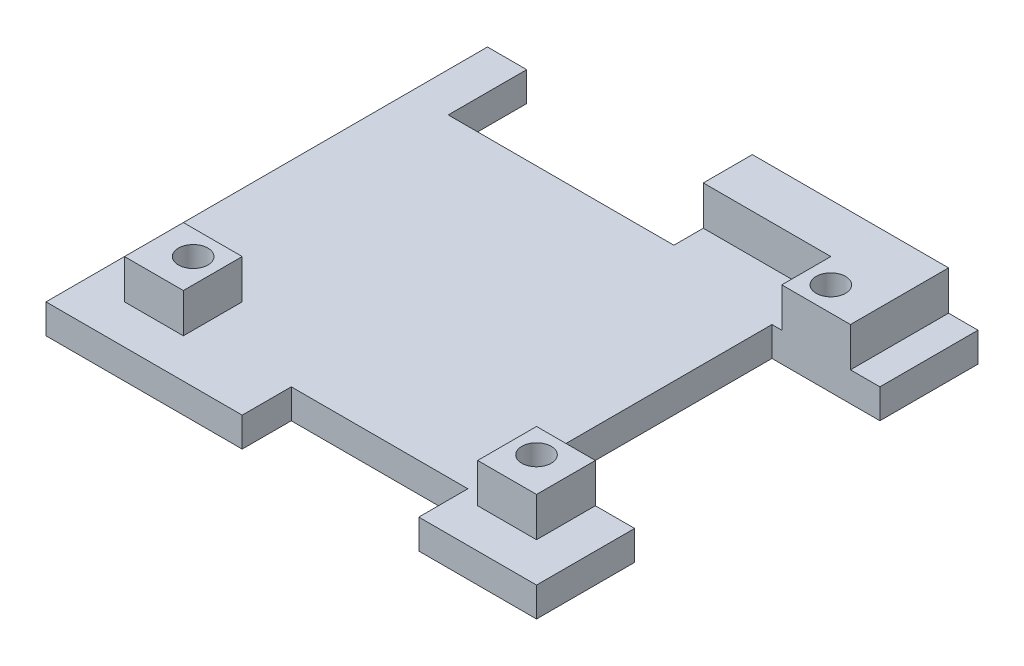
ISO-10303-21;
HEADER;
FILE_DESCRIPTION(('STEP AP214'),'2;1');
FILE_NAME('part.step','',(''),(''),'','','');
FILE_SCHEMA(('AUTOMOTIVE_DESIGN { 1 0 10303 214 1 1 1 1 }'));
ENDSEC;
DATA;
#1=APPLICATION_CONTEXT('core data for automotive mechanical design processes');
#2=APPLICATION_PROTOCOL_DEFINITION('international standard','automotive_design',2000,#1);
#3=PRODUCT_CONTEXT('',#1,'mechanical');
#4=PRODUCT('Part','Part','',(#3));
#5=PRODUCT_RELATED_PRODUCT_CATEGORY('part','',(#4));
#6=PRODUCT_DEFINITION_FORMATION('','',#4);
#7=PRODUCT_DEFINITION_CONTEXT('part definition',#1,'design');
#8=PRODUCT_DEFINITION('design','',#6,#7);
#9=PRODUCT_DEFINITION_SHAPE('','',#8);
#10=(LENGTH_UNIT() NAMED_UNIT(*) SI_UNIT(.MILLI.,.METRE.));
#11=(NAMED_UNIT(*) PLANE_ANGLE_UNIT() SI_UNIT($,.RADIAN.));
#12=(NAMED_UNIT(*) SI_UNIT($,.STERADIAN.) SOLID_ANGLE_UNIT());
#13=UNCERTAINTY_MEASURE_WITH_UNIT(LENGTH_MEASURE(1.E-05),#10,'distance_accuracy_value','');
#14=(GEOMETRIC_REPRESENTATION_CONTEXT(3) GLOBAL_UNCERTAINTY_ASSIGNED_CONTEXT((#13)) GLOBAL_UNIT_ASSIGNED_CONTEXT((#10,
#11,#12)) REPRESENTATION_CONTEXT('',''));
#15=CARTESIAN_POINT('',(0.,0.,0.));
#16=DIRECTION('',(0.,0.,1.));
#17=DIRECTION('',(1.,0.,0.));
#18=AXIS2_PLACEMENT_3D('',#15,#16,#17);
#19=CARTESIAN_POINT('',(0.,3.,0.));
#20=DIRECTION('',(0.,1.,0.));
#21=DIRECTION('',(0.,0.,1.));
#22=AXIS2_PLACEMENT_3D('',#19,#20,#21);
#23=PLANE('',#22);
#24=DIRECTION('',(1.,0.,0.));
#25=VECTOR('',#24,1.);
#26=CARTESIAN_POINT('',(14.,3.,12.5));
#27=LINE('',#26,#25);
#28=CARTESIAN_POINT('',(21.,3.,12.5));
#29=VERTEX_POINT('',#28);
#30=CARTESIAN_POINT('',(25.,3.,12.5));
#31=VERTEX_POINT('',#30);
#32=EDGE_CURVE('E824',#29,#31,#27,.T.);
#33=ORIENTED_EDGE('',*,*,#32,.F.);
#34=DIRECTION('',(0.,0.,-1.));
#35=VECTOR('',#34,1.);
#36=CARTESIAN_POINT('',(21.,3.,12.5));
#37=LINE('',#36,#35);
#38=CARTESIAN_POINT('',(21.,3.,18.5));
#39=VERTEX_POINT('',#38);
#40=EDGE_CURVE('E363',#39,#29,#37,.T.);
#41=ORIENTED_EDGE('',*,*,#40,.F.);
#42=DIRECTION('',(1.,0.,0.));
#43=VECTOR('',#42,1.);
#44=CARTESIAN_POINT('',(15.,3.,18.5));
#45=LINE('',#44,#43);
#46=CARTESIAN_POINT('',(15.,3.,18.5));
#47=VERTEX_POINT('',#46);
#48=EDGE_CURVE('E372',#47,#39,#45,.T.);
#49=ORIENTED_EDGE('',*,*,#48,.F.);
#50=DIRECTION('',(0.,0.,1.));
#51=VECTOR('',#50,1.);
#52=CARTESIAN_POINT('',(15.,3.,12.5));
#53=LINE('',#52,#51);
#54=CARTESIAN_POINT('',(15.,3.,12.5));
#55=VERTEX_POINT('',#54);
#56=EDGE_CURVE('E355',#55,#47,#53,.T.);
#57=ORIENTED_EDGE('',*,*,#56,.F.);
#58=CARTESIAN_POINT('',(14.,3.,12.5));
#59=VERTEX_POINT('',#58);
#60=EDGE_CURVE('E239',#59,#55,#27,.T.);
#61=ORIENTED_EDGE('',*,*,#60,.F.);
#62=DIRECTION('',(0.,0.,1.));
#63=VECTOR('',#62,1.);
#64=CARTESIAN_POINT('',(14.,3.,-12.5));
#65=LINE('',#64,#63);
#66=CARTESIAN_POINT('',(14.,3.,-12.5));
#67=VERTEX_POINT('',#66);
#68=EDGE_CURVE('E248',#67,#59,#65,.T.);
#69=ORIENTED_EDGE('',*,*,#68,.F.);
#70=DIRECTION('',(-1.,0.,0.));
#71=VECTOR('',#70,1.);
#72=CARTESIAN_POINT('',(25.,3.,-12.5));
#73=LINE('',#72,#71);
#74=CARTESIAN_POINT('',(15.,3.,-12.5));
#75=VERTEX_POINT('',#74);
#76=EDGE_CURVE('E249',#75,#67,#73,.T.);
#77=ORIENTED_EDGE('',*,*,#76,.F.);
#78=DIRECTION('',(0.,0.,1.));
#79=VECTOR('',#78,1.);
#80=CARTESIAN_POINT('',(15.,3.,-17.5));
#81=LINE('',#80,#79);
#82=CARTESIAN_POINT('',(15.,3.,-17.5));
#83=VERTEX_POINT('',#82);
#84=EDGE_CURVE('E417',#83,#75,#81,.T.);
#85=ORIENTED_EDGE('',*,*,#84,.F.);
#86=DIRECTION('',(1.,0.,0.));
#87=VECTOR('',#86,1.);
#88=CARTESIAN_POINT('',(2.,3.,-17.5));
#89=LINE('',#88,#87);
#90=CARTESIAN_POINT('',(2.,3.,-17.5));
#91=VERTEX_POINT('',#90);
#92=EDGE_CURVE('E429',#91,#83,#89,.T.);
#93=ORIENTED_EDGE('',*,*,#92,.F.);
#94=DIRECTION('',(0.,0.,-1.));
#95=VECTOR('',#94,1.);
#96=CARTESIAN_POINT('',(1.99999999999999,3.,-22.5));
#97=LINE('',#96,#95);
#98=CARTESIAN_POINT('',(1.99999999999999,3.,-14.5));
#99=VERTEX_POINT('',#98);
#100=EDGE_CURVE('E350',#99,#91,#97,.T.);
#101=ORIENTED_EDGE('',*,*,#100,.F.);
#102=DIRECTION('',(1.,0.,0.));
#103=VECTOR('',#102,1.);
#104=CARTESIAN_POINT('',(-21.,3.,-14.5));
#105=LINE('',#104,#103);
#106=CARTESIAN_POINT('',(-21.,3.,-14.5));
#107=VERTEX_POINT('',#106);
#108=EDGE_CURVE('E347',#107,#99,#105,.T.);
#109=ORIENTED_EDGE('',*,*,#108,.F.);
#110=DIRECTION('',(0.,0.,1.));
#111=VECTOR('',#110,1.);
#112=CARTESIAN_POINT('',(-21.,3.,-22.5));
#113=LINE('',#112,#111);
#114=CARTESIAN_POINT('',(-21.,3.,-22.5));
#115=VERTEX_POINT('',#114);
#116=EDGE_CURVE('E344',#115,#107,#113,.T.);
#117=ORIENTED_EDGE('',*,*,#116,.F.);
#118=DIRECTION('',(-1.,0.,0.));
#119=VECTOR('',#118,1.);
#120=CARTESIAN_POINT('',(-25.,3.,-22.5));
#121=LINE('',#120,#119);
#122=CARTESIAN_POINT('',(-25.,3.,-22.5));
#123=VERTEX_POINT('',#122);
#124=EDGE_CURVE('E258',#115,#123,#121,.T.);
#125=ORIENTED_EDGE('',*,*,#124,.T.);
#126=DIRECTION('',(0.,0.,1.));
#127=VECTOR('',#126,1.);
#128=CARTESIAN_POINT('',(-25.,3.,-22.5));
#129=LINE('',#128,#127);
#130=CARTESIAN_POINT('',(-25.,3.,22.5));
#131=VERTEX_POINT('',#130);
#132=EDGE_CURVE('E268',#123,#131,#129,.T.);
#133=ORIENTED_EDGE('',*,*,#132,.T.);
#134=DIRECTION('',(1.,0.,0.));
#135=VECTOR('',#134,1.);
#136=CARTESIAN_POINT('',(-25.,3.,22.5));
#137=LINE('',#136,#135);
#138=CARTESIAN_POINT('',(-5.,3.,22.5));
#139=VERTEX_POINT('',#138);
#140=EDGE_CURVE('E271',#131,#139,#137,.T.);
#141=ORIENTED_EDGE('',*,*,#140,.T.);
#142=DIRECTION('',(0.,0.,1.));
#143=VECTOR('',#142,1.);
#144=CARTESIAN_POINT('',(-5.,3.,22.5));
#145=LINE('',#144,#143);
#146=CARTESIAN_POINT('',(-5.,3.,17.5));
#147=VERTEX_POINT('',#146);
#148=EDGE_CURVE('E334',#147,#139,#145,.T.);
#149=ORIENTED_EDGE('',*,*,#148,.F.);
#150=DIRECTION('',(-1.,0.,0.));
#151=VECTOR('',#150,1.);
#152=CARTESIAN_POINT('',(-5.,3.,17.5));
#153=LINE('',#152,#151);
#154=CARTESIAN_POINT('',(13.,3.,17.5));
#155=VERTEX_POINT('',#154);
#156=EDGE_CURVE('E330',#155,#147,#153,.T.);
#157=ORIENTED_EDGE('',*,*,#156,.F.);
#158=DIRECTION('',(0.,0.,-1.));
#159=VECTOR('',#158,1.);
#160=CARTESIAN_POINT('',(13.,3.,17.5));
#161=LINE('',#160,#159);
#162=CARTESIAN_POINT('',(13.,3.,22.5));
#163=VERTEX_POINT('',#162);
#164=EDGE_CURVE('E328',#163,#155,#161,.T.);
#165=ORIENTED_EDGE('',*,*,#164,.F.);
#166=CARTESIAN_POINT('',(25.,3.,22.5));
#167=VERTEX_POINT('',#166);
#168=EDGE_CURVE('E270',#163,#167,#137,.T.);
#169=ORIENTED_EDGE('',*,*,#168,.T.);
#170=DIRECTION('',(0.,0.,-1.));
#171=VECTOR('',#170,1.);
#172=CARTESIAN_POINT('',(25.,3.,-22.5));
#173=LINE('',#172,#171);
#174=EDGE_CURVE('E254',#167,#31,#173,.T.);
#175=ORIENTED_EDGE('',*,*,#174,.T.);
#176=EDGE_LOOP('',(#33,#41,#49,#57,#61,#69,#77,#85,#93,#101,#109,#117,#125,#133,#141,#149,#157,
#165,#169,#175));
#177=FACE_BOUND('',#176,.T.);
#178=DIRECTION('',(1.,0.,0.));
#179=VECTOR('',#178,1.);
#180=CARTESIAN_POINT('',(-21.,3.,18.5));
#181=LINE('',#180,#179);
#182=CARTESIAN_POINT('',(-21.,3.,18.5));
#183=VERTEX_POINT('',#182);
#184=CARTESIAN_POINT('',(-15.,3.,18.5));
#185=VERTEX_POINT('',#184);
#186=EDGE_CURVE('E400',#183,#185,#181,.T.);
#187=ORIENTED_EDGE('',*,*,#186,.F.);
#188=DIRECTION('',(0.,0.,1.));
#189=VECTOR('',#188,1.);
#190=CARTESIAN_POINT('',(-21.,3.,12.5));
#191=LINE('',#190,#189);
#192=CARTESIAN_POINT('',(-21.,3.,12.5));
#193=VERTEX_POINT('',#192);
#194=EDGE_CURVE('E386',#193,#183,#191,.T.);
#195=ORIENTED_EDGE('',*,*,#194,.F.);
#196=DIRECTION('',(-1.,0.,0.));
#197=VECTOR('',#196,1.);
#198=CARTESIAN_POINT('',(-21.,3.,12.5));
#199=LINE('',#198,#197);
#200=CARTESIAN_POINT('',(-15.,3.,12.5));
#201=VERTEX_POINT('',#200);
#202=EDGE_CURVE('E391',#201,#193,#199,.T.);
#203=ORIENTED_EDGE('',*,*,#202,.F.);
#204=DIRECTION('',(0.,0.,-1.));
#205=VECTOR('',#204,1.);
#206=CARTESIAN_POINT('',(-15.,3.,12.5));
#207=LINE('',#206,#205);
#208=EDGE_CURVE('E402',#185,#201,#207,.T.);
#209=ORIENTED_EDGE('',*,*,#208,.F.);
#210=EDGE_LOOP('',(#187,#195,#203,#209));
#211=FACE_BOUND('',#210,.T.);
#212=ADVANCED_FACE('F34',(#177,#211),#23,.T.);
#213=CARTESIAN_POINT('',(25.,3.,-22.5));
#214=DIRECTION('',(-1.,0.,0.));
#215=DIRECTION('',(0.,0.,1.));
#216=AXIS2_PLACEMENT_3D('',#213,#214,#215);
#217=PLANE('',#216);
#218=DIRECTION('',(0.,0.,-1.));
#219=VECTOR('',#218,1.);
#220=CARTESIAN_POINT('',(25.,0.,-22.5));
#221=LINE('',#220,#219);
#222=CARTESIAN_POINT('',(25.,0.,22.5));
#223=VERTEX_POINT('',#222);
#224=CARTESIAN_POINT('',(25.,0.,12.5));
#225=VERTEX_POINT('',#224);
#226=EDGE_CURVE('E275',#223,#225,#221,.T.);
#227=ORIENTED_EDGE('',*,*,#226,.T.);
#228=DIRECTION('',(0.,1.,0.));
#229=VECTOR('',#228,1.);
#230=CARTESIAN_POINT('',(25.,-1.,12.5));
#231=LINE('',#230,#229);
#232=EDGE_CURVE('E324',#225,#31,#231,.T.);
#233=ORIENTED_EDGE('',*,*,#232,.T.);
#234=ORIENTED_EDGE('',*,*,#174,.F.);
#235=DIRECTION('',(0.,-1.,0.));
#236=VECTOR('',#235,1.);
#237=CARTESIAN_POINT('',(25.,3.,22.5));
#238=LINE('',#237,#236);
#239=EDGE_CURVE('E274',#167,#223,#238,.T.);
#240=ORIENTED_EDGE('',*,*,#239,.T.);
#241=EDGE_LOOP('',(#227,#233,#234,#240));
#242=FACE_BOUND('',#241,.T.);
#243=ADVANCED_FACE('F461',(#242),#217,.F.);
#244=CARTESIAN_POINT('',(-25.,3.,22.5));
#245=DIRECTION('',(0.,0.,-1.));
#246=DIRECTION('',(-1.,0.,0.));
#247=AXIS2_PLACEMENT_3D('',#244,#245,#246);
#248=PLANE('',#247);
#249=DIRECTION('',(1.,0.,0.));
#250=VECTOR('',#249,1.);
#251=CARTESIAN_POINT('',(-25.,0.,22.5));
#252=LINE('',#251,#250);
#253=CARTESIAN_POINT('',(-25.,0.,22.5));
#254=VERTEX_POINT('',#253);
#255=CARTESIAN_POINT('',(-5.,0.,22.5));
#256=VERTEX_POINT('',#255);
#257=EDGE_CURVE('E255',#254,#256,#252,.T.);
#258=ORIENTED_EDGE('',*,*,#257,.T.);
#259=DIRECTION('',(0.,1.,0.));
#260=VECTOR('',#259,1.);
#261=CARTESIAN_POINT('',(-5.,-1.,22.5));
#262=LINE('',#261,#260);
#263=EDGE_CURVE('E337',#256,#139,#262,.T.);
#264=ORIENTED_EDGE('',*,*,#263,.T.);
#265=ORIENTED_EDGE('',*,*,#140,.F.);
#266=DIRECTION('',(0.,-1.,0.));
#267=VECTOR('',#266,1.);
#268=CARTESIAN_POINT('',(-25.,3.,22.5));
#269=LINE('',#268,#267);
#270=EDGE_CURVE('E287',#131,#254,#269,.T.);
#271=ORIENTED_EDGE('',*,*,#270,.T.);
#272=EDGE_LOOP('',(#258,#264,#265,#271));
#273=FACE_BOUND('',#272,.T.);
#274=ADVANCED_FACE('F463',(#273),#248,.F.);
#275=CARTESIAN_POINT('',(-25.,3.,-22.5));
#276=DIRECTION('',(0.,0.,1.));
#277=DIRECTION('',(1.,0.,0.));
#278=AXIS2_PLACEMENT_3D('',#275,#276,#277);
#279=PLANE('',#278);
#280=ORIENTED_EDGE('',*,*,#124,.F.);
#281=DIRECTION('',(0.,1.,0.));
#282=VECTOR('',#281,1.);
#283=CARTESIAN_POINT('',(-21.,-1.,-22.5));
#284=LINE('',#283,#282);
#285=CARTESIAN_POINT('',(-21.,0.,-22.5));
#286=VERTEX_POINT('',#285);
#287=EDGE_CURVE('E353',#286,#115,#284,.T.);
#288=ORIENTED_EDGE('',*,*,#287,.F.);
#289=DIRECTION('',(-1.,0.,0.));
#290=VECTOR('',#289,1.);
#291=CARTESIAN_POINT('',(-25.,0.,-22.5));
#292=LINE('',#291,#290);
#293=CARTESIAN_POINT('',(-25.,0.,-22.5));
#294=VERTEX_POINT('',#293);
#295=EDGE_CURVE('E278',#286,#294,#292,.T.);
#296=ORIENTED_EDGE('',*,*,#295,.T.);
#297=DIRECTION('',(0.,-1.,0.));
#298=VECTOR('',#297,1.);
#299=CARTESIAN_POINT('',(-25.,3.,-22.5));
#300=LINE('',#299,#298);
#301=EDGE_CURVE('E290',#123,#294,#300,.T.);
#302=ORIENTED_EDGE('',*,*,#301,.F.);
#303=EDGE_LOOP('',(#280,#288,#296,#302));
#304=FACE_BOUND('',#303,.T.);
#305=ADVANCED_FACE('F453',(#304),#279,.F.);
#306=CARTESIAN_POINT('',(25.,3.,-12.5));
#307=VERTEX_POINT('',#306);
#308=CARTESIAN_POINT('',(22.,3.,-12.5));
#309=VERTEX_POINT('',#308);
#310=EDGE_CURVE('E230',#307,#309,#73,.T.);
#311=ORIENTED_EDGE('',*,*,#310,.F.);
#312=CARTESIAN_POINT('',(25.,3.,-22.5));
#313=VERTEX_POINT('',#312);
#314=EDGE_CURVE('E243',#307,#313,#173,.T.);
#315=ORIENTED_EDGE('',*,*,#314,.T.);
#316=CARTESIAN_POINT('',(22.,3.,-22.5));
#317=VERTEX_POINT('',#316);
#318=EDGE_CURVE('E266',#313,#317,#121,.T.);
#319=ORIENTED_EDGE('',*,*,#318,.T.);
#320=DIRECTION('',(0.,0.,-1.));
#321=VECTOR('',#320,1.);
#322=CARTESIAN_POINT('',(22.,3.,-22.5));
#323=LINE('',#322,#321);
#324=EDGE_CURVE('E246',#309,#317,#323,.T.);
#325=ORIENTED_EDGE('',*,*,#324,.F.);
#326=EDGE_LOOP('',(#311,#315,#319,#325));
#327=FACE_BOUND('',#326,.T.);
#328=ADVANCED_FACE('F242',(#327),#23,.T.);
#329=ORIENTED_EDGE('',*,*,#314,.F.);
#330=DIRECTION('',(0.,1.,0.));
#331=VECTOR('',#330,1.);
#332=CARTESIAN_POINT('',(25.,-1.,-12.5));
#333=LINE('',#332,#331);
#334=CARTESIAN_POINT('',(25.,0.,-12.5));
#335=VERTEX_POINT('',#334);
#336=EDGE_CURVE('E225',#335,#307,#333,.T.);
#337=ORIENTED_EDGE('',*,*,#336,.F.);
#338=CARTESIAN_POINT('',(25.,0.,-22.5));
#339=VERTEX_POINT('',#338);
#340=EDGE_CURVE('E279',#335,#339,#221,.T.);
#341=ORIENTED_EDGE('',*,*,#340,.T.);
#342=DIRECTION('',(0.,-1.,0.));
#343=VECTOR('',#342,1.);
#344=CARTESIAN_POINT('',(25.,3.,-22.5));
#345=LINE('',#344,#343);
#346=EDGE_CURVE('E253',#313,#339,#345,.T.);
#347=ORIENTED_EDGE('',*,*,#346,.F.);
#348=EDGE_LOOP('',(#329,#337,#341,#347));
#349=FACE_BOUND('',#348,.T.);
#350=ADVANCED_FACE('F36',(#349),#217,.F.);
#351=CARTESIAN_POINT('',(1.99999999999999,0.,-22.5));
#352=VERTEX_POINT('',#351);
#353=EDGE_CURVE('E280',#339,#352,#292,.T.);
#354=ORIENTED_EDGE('',*,*,#353,.T.);
#355=DIRECTION('',(0.,-1.,0.));
#356=VECTOR('',#355,1.);
#357=CARTESIAN_POINT('',(2.,7.,-22.5));
#358=LINE('',#357,#356);
#359=CARTESIAN_POINT('',(2.,7.,-22.5));
#360=VERTEX_POINT('',#359);
#361=EDGE_CURVE('E442',#360,#352,#358,.T.);
#362=ORIENTED_EDGE('',*,*,#361,.F.);
#363=DIRECTION('',(-1.,0.,0.));
#364=VECTOR('',#363,1.);
#365=CARTESIAN_POINT('',(22.,7.,-22.5));
#366=LINE('',#365,#364);
#367=CARTESIAN_POINT('',(22.,7.,-22.5));
#368=VERTEX_POINT('',#367);
#369=EDGE_CURVE('E416',#368,#360,#366,.T.);
#370=ORIENTED_EDGE('',*,*,#369,.F.);
#371=DIRECTION('',(0.,-1.,0.));
#372=VECTOR('',#371,1.);
#373=CARTESIAN_POINT('',(22.,7.,-22.5));
#374=LINE('',#373,#372);
#375=EDGE_CURVE('E264',#368,#317,#374,.T.);
#376=ORIENTED_EDGE('',*,*,#375,.T.);
#377=ORIENTED_EDGE('',*,*,#318,.F.);
#378=ORIENTED_EDGE('',*,*,#346,.T.);
#379=EDGE_LOOP('',(#354,#362,#370,#376,#377,#378));
#380=FACE_BOUND('',#379,.T.);
#381=ADVANCED_FACE('F450',(#380),#279,.F.);
#382=CARTESIAN_POINT('',(-25.,3.,-22.5));
#383=DIRECTION('',(1.,0.,0.));
#384=DIRECTION('',(0.,0.,-1.));
#385=AXIS2_PLACEMENT_3D('',#382,#383,#384);
#386=PLANE('',#385);
#387=DIRECTION('',(0.,0.,1.));
#388=VECTOR('',#387,1.);
#389=CARTESIAN_POINT('',(-25.,0.,-22.5));
#390=LINE('',#389,#388);
#391=EDGE_CURVE('E283',#294,#254,#390,.T.);
#392=ORIENTED_EDGE('',*,*,#391,.T.);
#393=ORIENTED_EDGE('',*,*,#270,.F.);
#394=ORIENTED_EDGE('',*,*,#132,.F.);
#395=ORIENTED_EDGE('',*,*,#301,.T.);
#396=EDGE_LOOP('',(#392,#393,#394,#395));
#397=FACE_BOUND('',#396,.T.);
#398=ADVANCED_FACE('F452',(#397),#386,.F.);
#399=ORIENTED_EDGE('',*,*,#168,.F.);
#400=DIRECTION('',(0.,1.,0.));
#401=VECTOR('',#400,1.);
#402=CARTESIAN_POINT('',(13.,-1.,22.5));
#403=LINE('',#402,#401);
#404=CARTESIAN_POINT('',(13.,0.,22.5));
#405=VERTEX_POINT('',#404);
#406=EDGE_CURVE('E336',#405,#163,#403,.T.);
#407=ORIENTED_EDGE('',*,*,#406,.F.);
#408=EDGE_CURVE('E260',#405,#223,#252,.T.);
#409=ORIENTED_EDGE('',*,*,#408,.T.);
#410=ORIENTED_EDGE('',*,*,#239,.F.);
#411=EDGE_LOOP('',(#399,#407,#409,#410));
#412=FACE_BOUND('',#411,.T.);
#413=ADVANCED_FACE('F458',(#412),#248,.F.);
#414=CARTESIAN_POINT('',(0.,0.,0.));
#415=DIRECTION('',(0.,1.,0.));
#416=DIRECTION('',(0.,0.,1.));
#417=AXIS2_PLACEMENT_3D('',#414,#415,#416);
#418=PLANE('',#417);
#419=CARTESIAN_POINT('',(-17.5,0.,15.));
#420=DIRECTION('',(0.,1.,0.));
#421=DIRECTION('',(0.,0.,1.));
#422=AXIS2_PLACEMENT_3D('',#419,#420,#421);
#423=CIRCLE('',#422,1.50000000000001);
#424=CARTESIAN_POINT('',(-17.5,0.,16.5));
#425=VERTEX_POINT('',#424);
#426=EDGE_CURVE('E852',#425,#425,#423,.T.);
#427=ORIENTED_EDGE('',*,*,#426,.T.);
#428=EDGE_LOOP('',(#427));
#429=FACE_BOUND('',#428,.T.);
#430=CARTESIAN_POINT('',(17.5,0.,15.));
#431=DIRECTION('',(0.,1.,0.));
#432=DIRECTION('',(0.,0.,1.));
#433=AXIS2_PLACEMENT_3D('',#430,#431,#432);
#434=CIRCLE('',#433,1.50000000000001);
#435=CARTESIAN_POINT('',(17.5,0.,16.5));
#436=VERTEX_POINT('',#435);
#437=EDGE_CURVE('E846',#436,#436,#434,.T.);
#438=ORIENTED_EDGE('',*,*,#437,.T.);
#439=EDGE_LOOP('',(#438));
#440=FACE_BOUND('',#439,.T.);
#441=CARTESIAN_POINT('',(17.5,0.,-15.));
#442=DIRECTION('',(0.,1.,0.));
#443=DIRECTION('',(0.,0.,1.));
#444=AXIS2_PLACEMENT_3D('',#441,#442,#443);
#445=CIRCLE('',#444,1.50000000000001);
#446=CARTESIAN_POINT('',(17.5,0.,-13.5));
#447=VERTEX_POINT('',#446);
#448=EDGE_CURVE('E331',#447,#447,#445,.T.);
#449=ORIENTED_EDGE('',*,*,#448,.T.);
#450=EDGE_LOOP('',(#449));
#451=FACE_BOUND('',#450,.T.);
#452=DIRECTION('',(0.,0.,1.));
#453=VECTOR('',#452,1.);
#454=CARTESIAN_POINT('',(14.,0.,0.));
#455=LINE('',#454,#453);
#456=CARTESIAN_POINT('',(14.,0.,-12.5));
#457=VERTEX_POINT('',#456);
#458=CARTESIAN_POINT('',(14.,0.,12.5));
#459=VERTEX_POINT('',#458);
#460=EDGE_CURVE('E42',#457,#459,#455,.T.);
#461=ORIENTED_EDGE('',*,*,#460,.T.);
#462=DIRECTION('',(1.,0.,0.));
#463=VECTOR('',#462,1.);
#464=CARTESIAN_POINT('',(0.,0.,12.5));
#465=LINE('',#464,#463);
#466=EDGE_CURVE('E11',#459,#225,#465,.T.);
#467=ORIENTED_EDGE('',*,*,#466,.T.);
#468=ORIENTED_EDGE('',*,*,#226,.F.);
#469=ORIENTED_EDGE('',*,*,#408,.F.);
#470=DIRECTION('',(0.,0.,-1.));
#471=VECTOR('',#470,1.);
#472=CARTESIAN_POINT('',(13.,0.,0.));
#473=LINE('',#472,#471);
#474=CARTESIAN_POINT('',(13.,0.,17.5));
#475=VERTEX_POINT('',#474);
#476=EDGE_CURVE('E303',#405,#475,#473,.T.);
#477=ORIENTED_EDGE('',*,*,#476,.T.);
#478=DIRECTION('',(-1.,0.,0.));
#479=VECTOR('',#478,1.);
#480=CARTESIAN_POINT('',(0.,0.,17.5));
#481=LINE('',#480,#479);
#482=CARTESIAN_POINT('',(-5.,0.,17.5));
#483=VERTEX_POINT('',#482);
#484=EDGE_CURVE('E306',#475,#483,#481,.T.);
#485=ORIENTED_EDGE('',*,*,#484,.T.);
#486=DIRECTION('',(0.,0.,1.));
#487=VECTOR('',#486,1.);
#488=CARTESIAN_POINT('',(-5.00000000000001,0.,0.));
#489=LINE('',#488,#487);
#490=EDGE_CURVE('E309',#483,#256,#489,.T.);
#491=ORIENTED_EDGE('',*,*,#490,.T.);
#492=ORIENTED_EDGE('',*,*,#257,.F.);
#493=ORIENTED_EDGE('',*,*,#391,.F.);
#494=ORIENTED_EDGE('',*,*,#295,.F.);
#495=DIRECTION('',(0.,0.,1.));
#496=VECTOR('',#495,1.);
#497=CARTESIAN_POINT('',(-21.,0.,0.));
#498=LINE('',#497,#496);
#499=CARTESIAN_POINT('',(-21.,0.,-14.5));
#500=VERTEX_POINT('',#499);
#501=EDGE_CURVE('E300',#286,#500,#498,.T.);
#502=ORIENTED_EDGE('',*,*,#501,.T.);
#503=DIRECTION('',(1.,0.,0.));
#504=VECTOR('',#503,1.);
#505=CARTESIAN_POINT('',(0.,0.,-14.5));
#506=LINE('',#505,#504);
#507=CARTESIAN_POINT('',(1.99999999999999,0.,-14.5));
#508=VERTEX_POINT('',#507);
#509=EDGE_CURVE('E294',#500,#508,#506,.T.);
#510=ORIENTED_EDGE('',*,*,#509,.T.);
#511=DIRECTION('',(0.,0.,-1.));
#512=VECTOR('',#511,1.);
#513=CARTESIAN_POINT('',(1.99999999999999,0.,0.));
#514=LINE('',#513,#512);
#515=EDGE_CURVE('E297',#508,#352,#514,.T.);
#516=ORIENTED_EDGE('',*,*,#515,.T.);
#517=ORIENTED_EDGE('',*,*,#353,.F.);
#518=ORIENTED_EDGE('',*,*,#340,.F.);
#519=DIRECTION('',(-1.,0.,0.));
#520=VECTOR('',#519,1.);
#521=CARTESIAN_POINT('',(0.,0.,-12.5));
#522=LINE('',#521,#520);
#523=EDGE_CURVE('E234',#335,#457,#522,.T.);
#524=ORIENTED_EDGE('',*,*,#523,.T.);
#525=EDGE_LOOP('',(#461,#467,#468,#469,#477,#485,#491,#492,#493,#494,#502,#510,#516,#517,#518,#524));
#526=FACE_BOUND('',#525,.T.);
#527=ADVANCED_FACE('F314',(#429,#440,#451,#526),#418,.F.);
#528=CARTESIAN_POINT('',(22.,7.,-22.5));
#529=DIRECTION('',(-1.,0.,0.));
#530=DIRECTION('',(0.,0.,1.));
#531=AXIS2_PLACEMENT_3D('',#528,#529,#530);
#532=PLANE('',#531);
#533=ORIENTED_EDGE('',*,*,#324,.T.);
#534=ORIENTED_EDGE('',*,*,#375,.F.);
#535=DIRECTION('',(0.,0.,-1.));
#536=VECTOR('',#535,1.);
#537=CARTESIAN_POINT('',(22.,7.,-22.5));
#538=LINE('',#537,#536);
#539=CARTESIAN_POINT('',(22.,7.,-12.5));
#540=VERTEX_POINT('',#539);
#541=EDGE_CURVE('E413',#540,#368,#538,.T.);
#542=ORIENTED_EDGE('',*,*,#541,.F.);
#543=DIRECTION('',(0.,-1.,0.));
#544=VECTOR('',#543,1.);
#545=CARTESIAN_POINT('',(22.,7.,-12.5));
#546=LINE('',#545,#544);
#547=EDGE_CURVE('E427',#540,#309,#546,.T.);
#548=ORIENTED_EDGE('',*,*,#547,.T.);
#549=EDGE_LOOP('',(#533,#534,#542,#548));
#550=FACE_BOUND('',#549,.T.);
#551=ADVANCED_FACE('F509',(#550),#532,.F.);
#552=CARTESIAN_POINT('',(2.,7.,-22.5));
#553=DIRECTION('',(1.,0.,0.));
#554=DIRECTION('',(0.,0.,-1.));
#555=AXIS2_PLACEMENT_3D('',#552,#553,#554);
#556=PLANE('',#555);
#557=ORIENTED_EDGE('',*,*,#361,.T.);
#558=ORIENTED_EDGE('',*,*,#515,.F.);
#559=DIRECTION('',(0.,1.,0.));
#560=VECTOR('',#559,1.);
#561=CARTESIAN_POINT('',(1.99999999999999,-1.,-14.5));
#562=LINE('',#561,#560);
#563=EDGE_CURVE('E356',#508,#99,#562,.T.);
#564=ORIENTED_EDGE('',*,*,#563,.T.);
#565=ORIENTED_EDGE('',*,*,#100,.T.);
#566=DIRECTION('',(0.,-1.,0.));
#567=VECTOR('',#566,1.);
#568=CARTESIAN_POINT('',(2.,7.,-17.5));
#569=LINE('',#568,#567);
#570=CARTESIAN_POINT('',(2.,7.,-17.5));
#571=VERTEX_POINT('',#570);
#572=EDGE_CURVE('E440',#571,#91,#569,.T.);
#573=ORIENTED_EDGE('',*,*,#572,.F.);
#574=DIRECTION('',(0.,0.,1.));
#575=VECTOR('',#574,1.);
#576=CARTESIAN_POINT('',(2.,7.,-22.5));
#577=LINE('',#576,#575);
#578=EDGE_CURVE('E419',#360,#571,#577,.T.);
#579=ORIENTED_EDGE('',*,*,#578,.F.);
#580=EDGE_LOOP('',(#557,#558,#564,#565,#573,#579));
#581=FACE_BOUND('',#580,.T.);
#582=ADVANCED_FACE('F513',(#581),#556,.F.);
#583=CARTESIAN_POINT('',(2.,7.,-17.5));
#584=DIRECTION('',(0.,0.,-1.));
#585=DIRECTION('',(-1.,0.,0.));
#586=AXIS2_PLACEMENT_3D('',#583,#584,#585);
#587=PLANE('',#586);
#588=ORIENTED_EDGE('',*,*,#92,.T.);
#589=DIRECTION('',(0.,-1.,0.));
#590=VECTOR('',#589,1.);
#591=CARTESIAN_POINT('',(15.,7.,-17.5));
#592=LINE('',#591,#590);
#593=CARTESIAN_POINT('',(15.,7.,-17.5));
#594=VERTEX_POINT('',#593);
#595=EDGE_CURVE('E437',#594,#83,#592,.T.);
#596=ORIENTED_EDGE('',*,*,#595,.F.);
#597=DIRECTION('',(1.,0.,0.));
#598=VECTOR('',#597,1.);
#599=CARTESIAN_POINT('',(2.,7.,-17.5));
#600=LINE('',#599,#598);
#601=EDGE_CURVE('E421',#571,#594,#600,.T.);
#602=ORIENTED_EDGE('',*,*,#601,.F.);
#603=ORIENTED_EDGE('',*,*,#572,.T.);
#604=EDGE_LOOP('',(#588,#596,#602,#603));
#605=FACE_BOUND('',#604,.T.);
#606=ADVANCED_FACE('F523',(#605),#587,.F.);
#607=CARTESIAN_POINT('',(15.,7.,-17.5));
#608=DIRECTION('',(1.,0.,0.));
#609=DIRECTION('',(0.,0.,-1.));
#610=AXIS2_PLACEMENT_3D('',#607,#608,#609);
#611=PLANE('',#610);
#612=ORIENTED_EDGE('',*,*,#84,.T.);
#613=DIRECTION('',(0.,-1.,0.));
#614=VECTOR('',#613,1.);
#615=CARTESIAN_POINT('',(15.,7.,-12.5));
#616=LINE('',#615,#614);
#617=CARTESIAN_POINT('',(15.,7.,-12.5));
#618=VERTEX_POINT('',#617);
#619=EDGE_CURVE('E435',#618,#75,#616,.T.);
#620=ORIENTED_EDGE('',*,*,#619,.F.);
#621=DIRECTION('',(0.,0.,1.));
#622=VECTOR('',#621,1.);
#623=CARTESIAN_POINT('',(15.,7.,-17.5));
#624=LINE('',#623,#622);
#625=EDGE_CURVE('E423',#594,#618,#624,.T.);
#626=ORIENTED_EDGE('',*,*,#625,.F.);
#627=ORIENTED_EDGE('',*,*,#595,.T.);
#628=EDGE_LOOP('',(#612,#620,#626,#627));
#629=FACE_BOUND('',#628,.T.);
#630=ADVANCED_FACE('F534',(#629),#611,.F.);
#631=CARTESIAN_POINT('',(22.,7.,-12.5));
#632=DIRECTION('',(0.,0.,-1.));
#633=DIRECTION('',(-1.,0.,0.));
#634=AXIS2_PLACEMENT_3D('',#631,#632,#633);
#635=PLANE('',#634);
#636=ORIENTED_EDGE('',*,*,#619,.T.);
#637=ORIENTED_EDGE('',*,*,#76,.T.);
#638=DIRECTION('',(0.,1.,0.));
#639=VECTOR('',#638,1.);
#640=CARTESIAN_POINT('',(14.,-1.,-12.5));
#641=LINE('',#640,#639);
#642=EDGE_CURVE('E238',#457,#67,#641,.T.);
#643=ORIENTED_EDGE('',*,*,#642,.F.);
#644=ORIENTED_EDGE('',*,*,#523,.F.);
#645=ORIENTED_EDGE('',*,*,#336,.T.);
#646=ORIENTED_EDGE('',*,*,#310,.T.);
#647=ORIENTED_EDGE('',*,*,#547,.F.);
#648=DIRECTION('',(1.,0.,0.));
#649=VECTOR('',#648,1.);
#650=CARTESIAN_POINT('',(22.,7.,-12.5));
#651=LINE('',#650,#649);
#652=EDGE_CURVE('E425',#618,#540,#651,.T.);
#653=ORIENTED_EDGE('',*,*,#652,.F.);
#654=EDGE_LOOP('',(#636,#637,#643,#644,#645,#646,#647,#653));
#655=FACE_BOUND('',#654,.T.);
#656=ADVANCED_FACE('F228',(#655),#635,.F.);
#657=CARTESIAN_POINT('',(0.,7.,0.));
#658=DIRECTION('',(0.,-1.,0.));
#659=DIRECTION('',(0.,0.,-1.));
#660=AXIS2_PLACEMENT_3D('',#657,#658,#659);
#661=PLANE('',#660);
#662=CARTESIAN_POINT('',(17.5,7.,-15.));
#663=DIRECTION('',(0.,1.,0.));
#664=DIRECTION('',(0.,0.,1.));
#665=AXIS2_PLACEMENT_3D('',#662,#663,#664);
#666=CIRCLE('',#665,1.50000000000002);
#667=CARTESIAN_POINT('',(17.5,7.,-13.5));
#668=VERTEX_POINT('',#667);
#669=EDGE_CURVE('E843',#668,#668,#666,.T.);
#670=ORIENTED_EDGE('',*,*,#669,.F.);
#671=EDGE_LOOP('',(#670));
#672=FACE_BOUND('',#671,.T.);
#673=ORIENTED_EDGE('',*,*,#541,.T.);
#674=ORIENTED_EDGE('',*,*,#369,.T.);
#675=ORIENTED_EDGE('',*,*,#578,.T.);
#676=ORIENTED_EDGE('',*,*,#601,.T.);
#677=ORIENTED_EDGE('',*,*,#625,.T.);
#678=ORIENTED_EDGE('',*,*,#652,.T.);
#679=EDGE_LOOP('',(#673,#674,#675,#676,#677,#678));
#680=FACE_BOUND('',#679,.T.);
#681=ADVANCED_FACE('F553',(#672,#680),#661,.F.);
#682=CARTESIAN_POINT('',(-21.,7.,12.5));
#683=DIRECTION('',(1.,0.,0.));
#684=DIRECTION('',(0.,0.,-1.));
#685=AXIS2_PLACEMENT_3D('',#682,#683,#684);
#686=PLANE('',#685);
#687=ORIENTED_EDGE('',*,*,#194,.T.);
#688=DIRECTION('',(0.,-1.,0.));
#689=VECTOR('',#688,1.);
#690=CARTESIAN_POINT('',(-21.,7.,18.5));
#691=LINE('',#690,#689);
#692=CARTESIAN_POINT('',(-21.,7.,18.5));
#693=VERTEX_POINT('',#692);
#694=EDGE_CURVE('E411',#693,#183,#691,.T.);
#695=ORIENTED_EDGE('',*,*,#694,.F.);
#696=DIRECTION('',(0.,0.,1.));
#697=VECTOR('',#696,1.);
#698=CARTESIAN_POINT('',(-21.,7.,12.5));
#699=LINE('',#698,#697);
#700=CARTESIAN_POINT('',(-21.,7.,12.5));
#701=VERTEX_POINT('',#700);
#702=EDGE_CURVE('E387',#701,#693,#699,.T.);
#703=ORIENTED_EDGE('',*,*,#702,.F.);
#704=DIRECTION('',(0.,-1.,0.));
#705=VECTOR('',#704,1.);
#706=CARTESIAN_POINT('',(-21.,7.,12.5));
#707=LINE('',#706,#705);
#708=EDGE_CURVE('E397',#701,#193,#707,.T.);
#709=ORIENTED_EDGE('',*,*,#708,.T.);
#710=EDGE_LOOP('',(#687,#695,#703,#709));
#711=FACE_BOUND('',#710,.T.);
#712=ADVANCED_FACE('F667',(#711),#686,.F.);
#713=CARTESIAN_POINT('',(-21.,7.,18.5));
#714=DIRECTION('',(0.,0.,-1.));
#715=DIRECTION('',(-1.,0.,0.));
#716=AXIS2_PLACEMENT_3D('',#713,#714,#715);
#717=PLANE('',#716);
#718=ORIENTED_EDGE('',*,*,#186,.T.);
#719=DIRECTION('',(0.,-1.,0.));
#720=VECTOR('',#719,1.);
#721=CARTESIAN_POINT('',(-15.,7.,18.5));
#722=LINE('',#721,#720);
#723=CARTESIAN_POINT('',(-15.,7.,18.5));
#724=VERTEX_POINT('',#723);
#725=EDGE_CURVE('E408',#724,#185,#722,.T.);
#726=ORIENTED_EDGE('',*,*,#725,.F.);
#727=DIRECTION('',(1.,0.,0.));
#728=VECTOR('',#727,1.);
#729=CARTESIAN_POINT('',(-21.,7.,18.5));
#730=LINE('',#729,#728);
#731=EDGE_CURVE('E390',#693,#724,#730,.T.);
#732=ORIENTED_EDGE('',*,*,#731,.F.);
#733=ORIENTED_EDGE('',*,*,#694,.T.);
#734=EDGE_LOOP('',(#718,#726,#732,#733));
#735=FACE_BOUND('',#734,.T.);
#736=ADVANCED_FACE('F729',(#735),#717,.F.);
#737=CARTESIAN_POINT('',(-15.,7.,12.5));
#738=DIRECTION('',(-1.,0.,0.));
#739=DIRECTION('',(0.,0.,1.));
#740=AXIS2_PLACEMENT_3D('',#737,#738,#739);
#741=PLANE('',#740);
#742=ORIENTED_EDGE('',*,*,#208,.T.);
#743=DIRECTION('',(0.,-1.,0.));
#744=VECTOR('',#743,1.);
#745=CARTESIAN_POINT('',(-15.,7.,12.5));
#746=LINE('',#745,#744);
#747=CARTESIAN_POINT('',(-15.,7.,12.5));
#748=VERTEX_POINT('',#747);
#749=EDGE_CURVE('E57',#748,#201,#746,.T.);
#750=ORIENTED_EDGE('',*,*,#749,.F.);
#751=DIRECTION('',(0.,0.,-1.));
#752=VECTOR('',#751,1.);
#753=CARTESIAN_POINT('',(-15.,7.,12.5));
#754=LINE('',#753,#752);
#755=EDGE_CURVE('E393',#724,#748,#754,.T.);
#756=ORIENTED_EDGE('',*,*,#755,.F.);
#757=ORIENTED_EDGE('',*,*,#725,.T.);
#758=EDGE_LOOP('',(#742,#750,#756,#757));
#759=FACE_BOUND('',#758,.T.);
#760=ADVANCED_FACE('F726',(#759),#741,.F.);
#761=CARTESIAN_POINT('',(-21.,7.,12.5));
#762=DIRECTION('',(0.,0.,1.));
#763=DIRECTION('',(1.,0.,0.));
#764=AXIS2_PLACEMENT_3D('',#761,#762,#763);
#765=PLANE('',#764);
#766=ORIENTED_EDGE('',*,*,#202,.T.);
#767=ORIENTED_EDGE('',*,*,#708,.F.);
#768=DIRECTION('',(-1.,0.,0.));
#769=VECTOR('',#768,1.);
#770=CARTESIAN_POINT('',(-21.,7.,12.5));
#771=LINE('',#770,#769);
#772=EDGE_CURVE('E395',#748,#701,#771,.T.);
#773=ORIENTED_EDGE('',*,*,#772,.F.);
#774=ORIENTED_EDGE('',*,*,#749,.T.);
#775=EDGE_LOOP('',(#766,#767,#773,#774));
#776=FACE_BOUND('',#775,.T.);
#777=ADVANCED_FACE('F677',(#776),#765,.F.);
#778=CARTESIAN_POINT('',(0.,7.,0.));
#779=DIRECTION('',(0.,1.,0.));
#780=DIRECTION('',(0.,0.,1.));
#781=AXIS2_PLACEMENT_3D('',#778,#779,#780);
#782=PLANE('',#781);
#783=CARTESIAN_POINT('',(-17.5,7.,15.));
#784=DIRECTION('',(0.,1.,0.));
#785=DIRECTION('',(0.,0.,1.));
#786=AXIS2_PLACEMENT_3D('',#783,#784,#785);
#787=CIRCLE('',#786,1.50000000000001);
#788=CARTESIAN_POINT('',(-17.5,7.,16.5));
#789=VERTEX_POINT('',#788);
#790=EDGE_CURVE('E855',#789,#789,#787,.T.);
#791=ORIENTED_EDGE('',*,*,#790,.F.);
#792=EDGE_LOOP('',(#791));
#793=FACE_BOUND('',#792,.T.);
#794=ORIENTED_EDGE('',*,*,#702,.T.);
#795=ORIENTED_EDGE('',*,*,#731,.T.);
#796=ORIENTED_EDGE('',*,*,#755,.T.);
#797=ORIENTED_EDGE('',*,*,#772,.T.);
#798=EDGE_LOOP('',(#794,#795,#796,#797));
#799=FACE_BOUND('',#798,.T.);
#800=ADVANCED_FACE('F566',(#793,#799),#782,.T.);
#801=CARTESIAN_POINT('',(15.,7.,12.5));
#802=DIRECTION('',(1.,0.,0.));
#803=DIRECTION('',(0.,0.,-1.));
#804=AXIS2_PLACEMENT_3D('',#801,#802,#803);
#805=PLANE('',#804);
#806=ORIENTED_EDGE('',*,*,#56,.T.);
#807=DIRECTION('',(0.,-1.,0.));
#808=VECTOR('',#807,1.);
#809=CARTESIAN_POINT('',(15.,7.,18.5));
#810=LINE('',#809,#808);
#811=CARTESIAN_POINT('',(15.,7.,18.5));
#812=VERTEX_POINT('',#811);
#813=EDGE_CURVE('E384',#812,#47,#810,.T.);
#814=ORIENTED_EDGE('',*,*,#813,.F.);
#815=DIRECTION('',(0.,0.,1.));
#816=VECTOR('',#815,1.);
#817=CARTESIAN_POINT('',(15.,7.,12.5));
#818=LINE('',#817,#816);
#819=CARTESIAN_POINT('',(15.,7.,12.5));
#820=VERTEX_POINT('',#819);
#821=EDGE_CURVE('E359',#820,#812,#818,.T.);
#822=ORIENTED_EDGE('',*,*,#821,.F.);
#823=DIRECTION('',(0.,-1.,0.));
#824=VECTOR('',#823,1.);
#825=CARTESIAN_POINT('',(15.,7.,12.5));
#826=LINE('',#825,#824);
#827=EDGE_CURVE('E369',#820,#55,#826,.T.);
#828=ORIENTED_EDGE('',*,*,#827,.T.);
#829=EDGE_LOOP('',(#806,#814,#822,#828));
#830=FACE_BOUND('',#829,.T.);
#831=ADVANCED_FACE('F560',(#830),#805,.F.);
#832=CARTESIAN_POINT('',(15.,7.,18.5));
#833=DIRECTION('',(0.,0.,-1.));
#834=DIRECTION('',(-1.,0.,0.));
#835=AXIS2_PLACEMENT_3D('',#832,#833,#834);
#836=PLANE('',#835);
#837=ORIENTED_EDGE('',*,*,#48,.T.);
#838=DIRECTION('',(0.,-1.,0.));
#839=VECTOR('',#838,1.);
#840=CARTESIAN_POINT('',(21.,7.,18.5));
#841=LINE('',#840,#839);
#842=CARTESIAN_POINT('',(21.,7.,18.5));
#843=VERTEX_POINT('',#842);
#844=EDGE_CURVE('E381',#843,#39,#841,.T.);
#845=ORIENTED_EDGE('',*,*,#844,.F.);
#846=DIRECTION('',(1.,0.,0.));
#847=VECTOR('',#846,1.);
#848=CARTESIAN_POINT('',(15.,7.,18.5));
#849=LINE('',#848,#847);
#850=EDGE_CURVE('E362',#812,#843,#849,.T.);
#851=ORIENTED_EDGE('',*,*,#850,.F.);
#852=ORIENTED_EDGE('',*,*,#813,.T.);
#853=EDGE_LOOP('',(#837,#845,#851,#852));
#854=FACE_BOUND('',#853,.T.);
#855=ADVANCED_FACE('F565',(#854),#836,.F.);
#856=CARTESIAN_POINT('',(21.,7.,12.5));
#857=DIRECTION('',(-1.,0.,0.));
#858=DIRECTION('',(0.,0.,1.));
#859=AXIS2_PLACEMENT_3D('',#856,#857,#858);
#860=PLANE('',#859);
#861=ORIENTED_EDGE('',*,*,#40,.T.);
#862=DIRECTION('',(0.,-1.,0.));
#863=VECTOR('',#862,1.);
#864=CARTESIAN_POINT('',(21.,7.,12.5));
#865=LINE('',#864,#863);
#866=CARTESIAN_POINT('',(21.,7.,12.5));
#867=VERTEX_POINT('',#866);
#868=EDGE_CURVE('E378',#867,#29,#865,.T.);
#869=ORIENTED_EDGE('',*,*,#868,.F.);
#870=DIRECTION('',(0.,0.,-1.));
#871=VECTOR('',#870,1.);
#872=CARTESIAN_POINT('',(21.,7.,12.5));
#873=LINE('',#872,#871);
#874=EDGE_CURVE('E365',#843,#867,#873,.T.);
#875=ORIENTED_EDGE('',*,*,#874,.F.);
#876=ORIENTED_EDGE('',*,*,#844,.T.);
#877=EDGE_LOOP('',(#861,#869,#875,#876));
#878=FACE_BOUND('',#877,.T.);
#879=ADVANCED_FACE('F576',(#878),#860,.F.);
#880=CARTESIAN_POINT('',(15.,7.,12.5));
#881=DIRECTION('',(0.,0.,1.));
#882=DIRECTION('',(1.,0.,0.));
#883=AXIS2_PLACEMENT_3D('',#880,#881,#882);
#884=PLANE('',#883);
#885=ORIENTED_EDGE('',*,*,#868,.T.);
#886=ORIENTED_EDGE('',*,*,#32,.T.);
#887=ORIENTED_EDGE('',*,*,#232,.F.);
#888=ORIENTED_EDGE('',*,*,#466,.F.);
#889=DIRECTION('',(0.,1.,0.));
#890=VECTOR('',#889,1.);
#891=CARTESIAN_POINT('',(14.,-1.,12.5));
#892=LINE('',#891,#890);
#893=EDGE_CURVE('E321',#459,#59,#892,.T.);
#894=ORIENTED_EDGE('',*,*,#893,.T.);
#895=ORIENTED_EDGE('',*,*,#60,.T.);
#896=ORIENTED_EDGE('',*,*,#827,.F.);
#897=DIRECTION('',(-1.,0.,0.));
#898=VECTOR('',#897,1.);
#899=CARTESIAN_POINT('',(15.,7.,12.5));
#900=LINE('',#899,#898);
#901=EDGE_CURVE('E367',#867,#820,#900,.T.);
#902=ORIENTED_EDGE('',*,*,#901,.F.);
#903=EDGE_LOOP('',(#885,#886,#887,#888,#894,#895,#896,#902));
#904=FACE_BOUND('',#903,.T.);
#905=ADVANCED_FACE('F581',(#904),#884,.F.);
#906=CARTESIAN_POINT('',(0.,7.,0.));
#907=DIRECTION('',(0.,1.,0.));
#908=DIRECTION('',(0.,0.,1.));
#909=AXIS2_PLACEMENT_3D('',#906,#907,#908);
#910=PLANE('',#909);
#911=CARTESIAN_POINT('',(17.5,7.,15.));
#912=DIRECTION('',(0.,1.,0.));
#913=DIRECTION('',(0.,0.,1.));
#914=AXIS2_PLACEMENT_3D('',#911,#912,#913);
#915=CIRCLE('',#914,1.50000000000001);
#916=CARTESIAN_POINT('',(17.5,7.,16.5));
#917=VERTEX_POINT('',#916);
#918=EDGE_CURVE('E849',#917,#917,#915,.T.);
#919=ORIENTED_EDGE('',*,*,#918,.F.);
#920=EDGE_LOOP('',(#919));
#921=FACE_BOUND('',#920,.T.);
#922=ORIENTED_EDGE('',*,*,#821,.T.);
#923=ORIENTED_EDGE('',*,*,#850,.T.);
#924=ORIENTED_EDGE('',*,*,#874,.T.);
#925=ORIENTED_EDGE('',*,*,#901,.T.);
#926=EDGE_LOOP('',(#922,#923,#924,#925));
#927=FACE_BOUND('',#926,.T.);
#928=ADVANCED_FACE('F591',(#921,#927),#910,.T.);
#929=CARTESIAN_POINT('',(-21.,-1.,-22.5));
#930=DIRECTION('',(-1.,0.,0.));
#931=DIRECTION('',(0.,0.,1.));
#932=AXIS2_PLACEMENT_3D('',#929,#930,#931);
#933=PLANE('',#932);
#934=ORIENTED_EDGE('',*,*,#287,.T.);
#935=ORIENTED_EDGE('',*,*,#116,.T.);
#936=DIRECTION('',(0.,1.,0.));
#937=VECTOR('',#936,1.);
#938=CARTESIAN_POINT('',(-21.,-1.,-14.5));
#939=LINE('',#938,#937);
#940=EDGE_CURVE('E352',#500,#107,#939,.T.);
#941=ORIENTED_EDGE('',*,*,#940,.F.);
#942=ORIENTED_EDGE('',*,*,#501,.F.);
#943=EDGE_LOOP('',(#934,#935,#941,#942));
#944=FACE_BOUND('',#943,.T.);
#945=ADVANCED_FACE('F599',(#944),#933,.F.);
#946=CARTESIAN_POINT('',(-21.,-1.,-14.5));
#947=DIRECTION('',(0.,0.,1.));
#948=DIRECTION('',(1.,0.,0.));
#949=AXIS2_PLACEMENT_3D('',#946,#947,#948);
#950=PLANE('',#949);
#951=ORIENTED_EDGE('',*,*,#940,.T.);
#952=ORIENTED_EDGE('',*,*,#108,.T.);
#953=ORIENTED_EDGE('',*,*,#563,.F.);
#954=ORIENTED_EDGE('',*,*,#509,.F.);
#955=EDGE_LOOP('',(#951,#952,#953,#954));
#956=FACE_BOUND('',#955,.T.);
#957=ADVANCED_FACE('F603',(#956),#950,.F.);
#958=CARTESIAN_POINT('',(14.,-1.,-12.5));
#959=DIRECTION('',(-1.,0.,0.));
#960=DIRECTION('',(0.,0.,1.));
#961=AXIS2_PLACEMENT_3D('',#958,#959,#960);
#962=PLANE('',#961);
#963=ORIENTED_EDGE('',*,*,#642,.T.);
#964=ORIENTED_EDGE('',*,*,#68,.T.);
#965=ORIENTED_EDGE('',*,*,#893,.F.);
#966=ORIENTED_EDGE('',*,*,#460,.F.);
#967=EDGE_LOOP('',(#963,#964,#965,#966));
#968=FACE_BOUND('',#967,.T.);
#969=ADVANCED_FACE('F318',(#968),#962,.F.);
#970=CARTESIAN_POINT('',(-5.,-1.,22.5));
#971=DIRECTION('',(-1.,0.,0.));
#972=DIRECTION('',(0.,0.,1.));
#973=AXIS2_PLACEMENT_3D('',#970,#971,#972);
#974=PLANE('',#973);
#975=DIRECTION('',(0.,1.,0.));
#976=VECTOR('',#975,1.);
#977=CARTESIAN_POINT('',(-5.,-1.,17.5));
#978=LINE('',#977,#976);
#979=EDGE_CURVE('E340',#483,#147,#978,.T.);
#980=ORIENTED_EDGE('',*,*,#979,.T.);
#981=ORIENTED_EDGE('',*,*,#148,.T.);
#982=ORIENTED_EDGE('',*,*,#263,.F.);
#983=ORIENTED_EDGE('',*,*,#490,.F.);
#984=EDGE_LOOP('',(#980,#981,#982,#983));
#985=FACE_BOUND('',#984,.T.);
#986=ADVANCED_FACE('F622',(#985),#974,.F.);
#987=CARTESIAN_POINT('',(-5.,-1.,17.5));
#988=DIRECTION('',(0.,0.,-1.));
#989=DIRECTION('',(-1.,0.,0.));
#990=AXIS2_PLACEMENT_3D('',#987,#988,#989);
#991=PLANE('',#990);
#992=DIRECTION('',(0.,1.,0.));
#993=VECTOR('',#992,1.);
#994=CARTESIAN_POINT('',(13.,-1.,17.5));
#995=LINE('',#994,#993);
#996=EDGE_CURVE('E49',#475,#155,#995,.T.);
#997=ORIENTED_EDGE('',*,*,#996,.T.);
#998=ORIENTED_EDGE('',*,*,#156,.T.);
#999=ORIENTED_EDGE('',*,*,#979,.F.);
#1000=ORIENTED_EDGE('',*,*,#484,.F.);
#1001=EDGE_LOOP('',(#997,#998,#999,#1000));
#1002=FACE_BOUND('',#1001,.T.);
#1003=ADVANCED_FACE('F631',(#1002),#991,.F.);
#1004=CARTESIAN_POINT('',(13.,-1.,17.5));
#1005=DIRECTION('',(1.,0.,0.));
#1006=DIRECTION('',(0.,0.,-1.));
#1007=AXIS2_PLACEMENT_3D('',#1004,#1005,#1006);
#1008=PLANE('',#1007);
#1009=ORIENTED_EDGE('',*,*,#406,.T.);
#1010=ORIENTED_EDGE('',*,*,#164,.T.);
#1011=ORIENTED_EDGE('',*,*,#996,.F.);
#1012=ORIENTED_EDGE('',*,*,#476,.F.);
#1013=EDGE_LOOP('',(#1009,#1010,#1011,#1012));
#1014=FACE_BOUND('',#1013,.T.);
#1015=ADVANCED_FACE('F641',(#1014),#1008,.F.);
#1016=CARTESIAN_POINT('',(17.5,7.,-15.));
#1017=DIRECTION('',(0.,1.,0.));
#1018=DIRECTION('',(0.,0.,1.));
#1019=AXIS2_PLACEMENT_3D('',#1016,#1017,#1018);
#1020=CYLINDRICAL_SURFACE('',#1019,1.50000000000001);
#1021=ORIENTED_EDGE('',*,*,#448,.F.);
#1022=EDGE_LOOP('',(#1021));
#1023=FACE_BOUND('',#1022,.T.);
#1024=ORIENTED_EDGE('',*,*,#669,.T.);
#1025=EDGE_LOOP('',(#1024));
#1026=FACE_BOUND('',#1025,.T.);
#1027=ADVANCED_FACE('F651',(#1023,#1026),#1020,.F.);
#1028=CARTESIAN_POINT('',(17.5,7.,15.));
#1029=DIRECTION('',(0.,1.,0.));
#1030=DIRECTION('',(0.,0.,1.));
#1031=AXIS2_PLACEMENT_3D('',#1028,#1029,#1030);
#1032=CYLINDRICAL_SURFACE('',#1031,1.50000000000001);
#1033=ORIENTED_EDGE('',*,*,#437,.F.);
#1034=EDGE_LOOP('',(#1033));
#1035=FACE_BOUND('',#1034,.T.);
#1036=ORIENTED_EDGE('',*,*,#918,.T.);
#1037=EDGE_LOOP('',(#1036));
#1038=FACE_BOUND('',#1037,.T.);
#1039=ADVANCED_FACE('F696',(#1035,#1038),#1032,.F.);
#1040=CARTESIAN_POINT('',(-17.5,7.,15.));
#1041=DIRECTION('',(0.,1.,0.));
#1042=DIRECTION('',(0.,0.,1.));
#1043=AXIS2_PLACEMENT_3D('',#1040,#1041,#1042);
#1044=CYLINDRICAL_SURFACE('',#1043,1.50000000000001);
#1045=ORIENTED_EDGE('',*,*,#426,.F.);
#1046=EDGE_LOOP('',(#1045));
#1047=FACE_BOUND('',#1046,.T.);
#1048=ORIENTED_EDGE('',*,*,#790,.T.);
#1049=EDGE_LOOP('',(#1048));
#1050=FACE_BOUND('',#1049,.T.);
#1051=ADVANCED_FACE('F706',(#1047,#1050),#1044,.F.);
#1052=CLOSED_SHELL('',(#212,#243,#274,#305,#328,#350,#381,#398,#413,#527,#551,#582,#606,#630,
#656,#681,#712,#736,#760,#777,#800,#831,#855,#879,#905,#928,#945,#957,#969,#986,#1003,#1015,
#1027,#1039,#1051));
#1053=MANIFOLD_SOLID_BREP('B2',#1052);
#1054=ADVANCED_BREP_SHAPE_REPRESENTATION('',(#18,#1053),#14);
#1055=SHAPE_DEFINITION_REPRESENTATION(#9,#1054);
ENDSEC;
END-ISO-10303-21;
